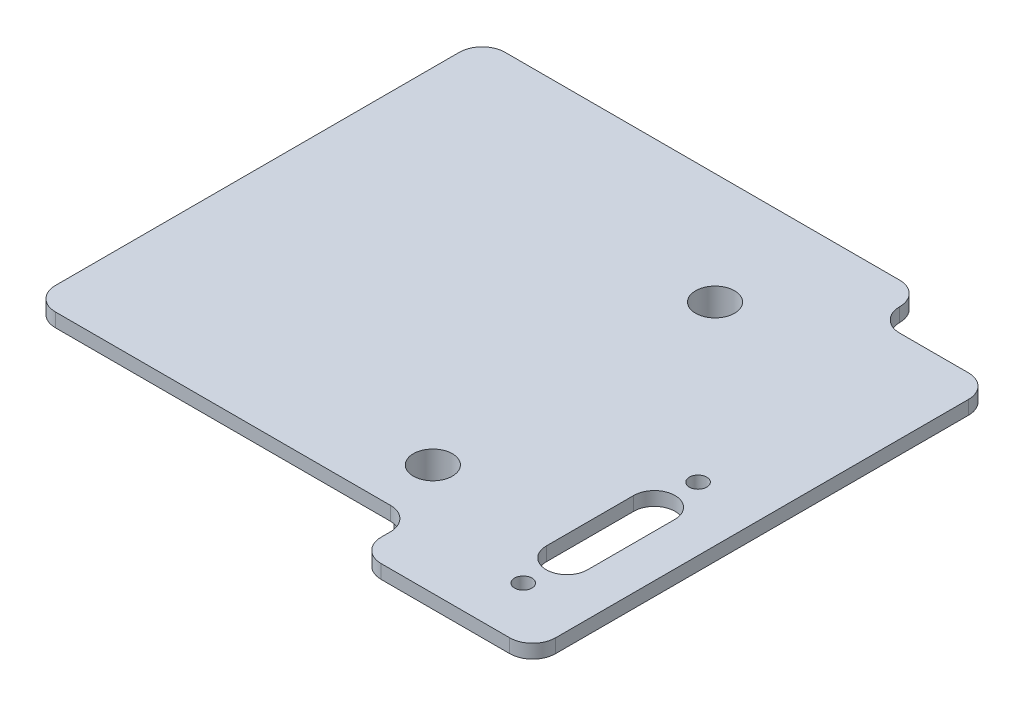
ISO-10303-21;
HEADER;
FILE_DESCRIPTION(('STEP AP214'),'2;1');
FILE_NAME('part.step','',(''),(''),'','','');
FILE_SCHEMA(('AUTOMOTIVE_DESIGN { 1 0 10303 214 1 1 1 1 }'));
ENDSEC;
DATA;
#1=APPLICATION_CONTEXT('core data for automotive mechanical design processes');
#2=APPLICATION_PROTOCOL_DEFINITION('international standard','automotive_design',2000,#1);
#3=PRODUCT_CONTEXT('',#1,'mechanical');
#4=PRODUCT('Part','Part','',(#3));
#5=PRODUCT_RELATED_PRODUCT_CATEGORY('part','',(#4));
#6=PRODUCT_DEFINITION_FORMATION('','',#4);
#7=PRODUCT_DEFINITION_CONTEXT('part definition',#1,'design');
#8=PRODUCT_DEFINITION('design','',#6,#7);
#9=PRODUCT_DEFINITION_SHAPE('','',#8);
#10=(LENGTH_UNIT() NAMED_UNIT(*) SI_UNIT(.MILLI.,.METRE.));
#11=(NAMED_UNIT(*) PLANE_ANGLE_UNIT() SI_UNIT($,.RADIAN.));
#12=(NAMED_UNIT(*) SI_UNIT($,.STERADIAN.) SOLID_ANGLE_UNIT());
#13=UNCERTAINTY_MEASURE_WITH_UNIT(LENGTH_MEASURE(1.E-05),#10,'distance_accuracy_value','');
#14=(GEOMETRIC_REPRESENTATION_CONTEXT(3) GLOBAL_UNCERTAINTY_ASSIGNED_CONTEXT((#13)) GLOBAL_UNIT_ASSIGNED_CONTEXT((#10,
#11,#12)) REPRESENTATION_CONTEXT('',''));
#15=CARTESIAN_POINT('',(0.,0.,0.));
#16=DIRECTION('',(0.,0.,1.));
#17=DIRECTION('',(1.,0.,0.));
#18=AXIS2_PLACEMENT_3D('',#15,#16,#17);
#19=CARTESIAN_POINT('',(0.,3.,-98.));
#20=DIRECTION('',(1.,0.,0.));
#21=DIRECTION('',(0.,0.,-1.));
#22=AXIS2_PLACEMENT_3D('',#19,#20,#21);
#23=PLANE('',#22);
#24=DIRECTION('',(0.,0.,1.));
#25=VECTOR('',#24,1.);
#26=CARTESIAN_POINT('',(0.,3.,-98.));
#27=LINE('',#26,#25);
#28=CARTESIAN_POINT('',(0.,3.,-93.));
#29=VERTEX_POINT('',#28);
#30=CARTESIAN_POINT('',(0.,3.,-5.));
#31=VERTEX_POINT('',#30);
#32=EDGE_CURVE('E224',#29,#31,#27,.T.);
#33=ORIENTED_EDGE('',*,*,#32,.F.);
#34=DIRECTION('',(0.,-1.,0.));
#35=VECTOR('',#34,1.);
#36=CARTESIAN_POINT('',(0.,3.,-93.));
#37=LINE('',#36,#35);
#38=CARTESIAN_POINT('',(0.,0.,-93.));
#39=VERTEX_POINT('',#38);
#40=EDGE_CURVE('E326',#29,#39,#37,.T.);
#41=ORIENTED_EDGE('',*,*,#40,.T.);
#42=DIRECTION('',(0.,0.,1.));
#43=VECTOR('',#42,1.);
#44=CARTESIAN_POINT('',(0.,0.,-98.));
#45=LINE('',#44,#43);
#46=CARTESIAN_POINT('',(0.,0.,-5.));
#47=VERTEX_POINT('',#46);
#48=EDGE_CURVE('E221',#39,#47,#45,.T.);
#49=ORIENTED_EDGE('',*,*,#48,.T.);
#50=DIRECTION('',(0.,-1.,0.));
#51=VECTOR('',#50,1.);
#52=CARTESIAN_POINT('',(0.,3.,-5.));
#53=LINE('',#52,#51);
#54=EDGE_CURVE('E324',#47,#31,#53,.F.);
#55=ORIENTED_EDGE('',*,*,#54,.T.);
#56=EDGE_LOOP('',(#33,#41,#49,#55));
#57=FACE_BOUND('',#56,.T.);
#58=ADVANCED_FACE('F35',(#57),#23,.F.);
#59=CARTESIAN_POINT('',(0.,3.,0.));
#60=DIRECTION('',(0.,0.,-1.));
#61=DIRECTION('',(-1.,0.,0.));
#62=AXIS2_PLACEMENT_3D('',#59,#60,#61);
#63=PLANE('',#62);
#64=DIRECTION('',(1.,0.,0.));
#65=VECTOR('',#64,1.);
#66=CARTESIAN_POINT('',(0.,0.,0.));
#67=LINE('',#66,#65);
#68=CARTESIAN_POINT('',(5.,0.,0.));
#69=VERTEX_POINT('',#68);
#70=CARTESIAN_POINT('',(78.,0.,0.));
#71=VERTEX_POINT('',#70);
#72=EDGE_CURVE('E248',#69,#71,#67,.T.);
#73=ORIENTED_EDGE('',*,*,#72,.T.);
#74=DIRECTION('',(0.,-1.,0.));
#75=VECTOR('',#74,1.);
#76=CARTESIAN_POINT('',(78.,3.,0.));
#77=LINE('',#76,#75);
#78=CARTESIAN_POINT('',(78.,3.,0.));
#79=VERTEX_POINT('',#78);
#80=EDGE_CURVE('E380',#71,#79,#77,.F.);
#81=ORIENTED_EDGE('',*,*,#80,.T.);
#82=DIRECTION('',(1.,0.,0.));
#83=VECTOR('',#82,1.);
#84=CARTESIAN_POINT('',(0.,3.,0.));
#85=LINE('',#84,#83);
#86=CARTESIAN_POINT('',(5.,3.,0.));
#87=VERTEX_POINT('',#86);
#88=EDGE_CURVE('E227',#87,#79,#85,.T.);
#89=ORIENTED_EDGE('',*,*,#88,.F.);
#90=DIRECTION('',(0.,-1.,0.));
#91=VECTOR('',#90,1.);
#92=CARTESIAN_POINT('',(5.,3.,0.));
#93=LINE('',#92,#91);
#94=EDGE_CURVE('E377',#87,#69,#93,.T.);
#95=ORIENTED_EDGE('',*,*,#94,.T.);
#96=EDGE_LOOP('',(#73,#81,#89,#95));
#97=FACE_BOUND('',#96,.T.);
#98=ADVANCED_FACE('F394',(#97),#63,.F.);
#99=CARTESIAN_POINT('',(83.,3.,0.));
#100=DIRECTION('',(1.,0.,0.));
#101=DIRECTION('',(0.,0.,-1.));
#102=AXIS2_PLACEMENT_3D('',#99,#100,#101);
#103=PLANE('',#102);
#104=DIRECTION('',(0.,0.,1.));
#105=VECTOR('',#104,1.);
#106=CARTESIAN_POINT('',(83.,0.,0.));
#107=LINE('',#106,#105);
#108=CARTESIAN_POINT('',(83.,0.,5.));
#109=VERTEX_POINT('',#108);
#110=CARTESIAN_POINT('',(83.,0.,6.99999999999998));
#111=VERTEX_POINT('',#110);
#112=EDGE_CURVE('E251',#109,#111,#107,.T.);
#113=ORIENTED_EDGE('',*,*,#112,.T.);
#114=DIRECTION('',(0.,-1.,0.));
#115=VECTOR('',#114,1.);
#116=CARTESIAN_POINT('',(83.,3.,6.99999999999998));
#117=LINE('',#116,#115);
#118=CARTESIAN_POINT('',(83.,3.,6.99999999999998));
#119=VERTEX_POINT('',#118);
#120=EDGE_CURVE('E375',#111,#119,#117,.F.);
#121=ORIENTED_EDGE('',*,*,#120,.T.);
#122=DIRECTION('',(0.,0.,1.));
#123=VECTOR('',#122,1.);
#124=CARTESIAN_POINT('',(83.,3.,0.));
#125=LINE('',#124,#123);
#126=CARTESIAN_POINT('',(83.,3.,5.));
#127=VERTEX_POINT('',#126);
#128=EDGE_CURVE('E231',#127,#119,#125,.T.);
#129=ORIENTED_EDGE('',*,*,#128,.F.);
#130=DIRECTION('',(0.,-1.,0.));
#131=VECTOR('',#130,1.);
#132=CARTESIAN_POINT('',(83.,0.,5.));
#133=LINE('',#132,#131);
#134=EDGE_CURVE('E372',#127,#109,#133,.T.);
#135=ORIENTED_EDGE('',*,*,#134,.T.);
#136=EDGE_LOOP('',(#113,#121,#129,#135));
#137=FACE_BOUND('',#136,.T.);
#138=ADVANCED_FACE('F402',(#137),#103,.F.);
#139=CARTESIAN_POINT('',(83.,3.,12.));
#140=DIRECTION('',(0.,0.,-1.));
#141=DIRECTION('',(-1.,0.,0.));
#142=AXIS2_PLACEMENT_3D('',#139,#140,#141);
#143=PLANE('',#142);
#144=DIRECTION('',(1.,0.,0.));
#145=VECTOR('',#144,1.);
#146=CARTESIAN_POINT('',(83.,0.,12.));
#147=LINE('',#146,#145);
#148=CARTESIAN_POINT('',(88.,0.,12.));
#149=VERTEX_POINT('',#148);
#150=CARTESIAN_POINT('',(116.,0.,12.));
#151=VERTEX_POINT('',#150);
#152=EDGE_CURVE('E254',#149,#151,#147,.T.);
#153=ORIENTED_EDGE('',*,*,#152,.T.);
#154=DIRECTION('',(0.,-1.,0.));
#155=VECTOR('',#154,1.);
#156=CARTESIAN_POINT('',(116.,3.,12.));
#157=LINE('',#156,#155);
#158=CARTESIAN_POINT('',(116.,3.,12.));
#159=VERTEX_POINT('',#158);
#160=EDGE_CURVE('E370',#151,#159,#157,.F.);
#161=ORIENTED_EDGE('',*,*,#160,.T.);
#162=DIRECTION('',(1.,0.,0.));
#163=VECTOR('',#162,1.);
#164=CARTESIAN_POINT('',(83.,3.,12.));
#165=LINE('',#164,#163);
#166=CARTESIAN_POINT('',(88.,3.,12.));
#167=VERTEX_POINT('',#166);
#168=EDGE_CURVE('E234',#167,#159,#165,.T.);
#169=ORIENTED_EDGE('',*,*,#168,.F.);
#170=DIRECTION('',(0.,-1.,0.));
#171=VECTOR('',#170,1.);
#172=CARTESIAN_POINT('',(88.,3.,12.));
#173=LINE('',#172,#171);
#174=EDGE_CURVE('E367',#167,#149,#173,.T.);
#175=ORIENTED_EDGE('',*,*,#174,.T.);
#176=EDGE_LOOP('',(#153,#161,#169,#175));
#177=FACE_BOUND('',#176,.T.);
#178=ADVANCED_FACE('F410',(#177),#143,.F.);
#179=CARTESIAN_POINT('',(121.,3.,12.));
#180=DIRECTION('',(-1.,0.,0.));
#181=DIRECTION('',(0.,0.,1.));
#182=AXIS2_PLACEMENT_3D('',#179,#180,#181);
#183=PLANE('',#182);
#184=DIRECTION('',(0.,0.,-1.));
#185=VECTOR('',#184,1.);
#186=CARTESIAN_POINT('',(121.,0.,12.));
#187=LINE('',#186,#185);
#188=CARTESIAN_POINT('',(121.,0.,6.99999999999998));
#189=VERTEX_POINT('',#188);
#190=CARTESIAN_POINT('',(121.,0.,-83.));
#191=VERTEX_POINT('',#190);
#192=EDGE_CURVE('E257',#189,#191,#187,.T.);
#193=ORIENTED_EDGE('',*,*,#192,.T.);
#194=DIRECTION('',(0.,-1.,0.));
#195=VECTOR('',#194,1.);
#196=CARTESIAN_POINT('',(121.,3.,-83.));
#197=LINE('',#196,#195);
#198=CARTESIAN_POINT('',(121.,3.,-83.));
#199=VERTEX_POINT('',#198);
#200=EDGE_CURVE('E365',#191,#199,#197,.F.);
#201=ORIENTED_EDGE('',*,*,#200,.T.);
#202=DIRECTION('',(0.,0.,-1.));
#203=VECTOR('',#202,1.);
#204=CARTESIAN_POINT('',(121.,3.,12.));
#205=LINE('',#204,#203);
#206=CARTESIAN_POINT('',(121.,3.,6.99999999999998));
#207=VERTEX_POINT('',#206);
#208=EDGE_CURVE('E237',#207,#199,#205,.T.);
#209=ORIENTED_EDGE('',*,*,#208,.F.);
#210=DIRECTION('',(0.,-1.,0.));
#211=VECTOR('',#210,1.);
#212=CARTESIAN_POINT('',(121.,3.,6.99999999999998));
#213=LINE('',#212,#211);
#214=EDGE_CURVE('E362',#207,#189,#213,.T.);
#215=ORIENTED_EDGE('',*,*,#214,.T.);
#216=EDGE_LOOP('',(#193,#201,#209,#215));
#217=FACE_BOUND('',#216,.T.);
#218=ADVANCED_FACE('F419',(#217),#183,.F.);
#219=CARTESIAN_POINT('',(96.,3.,-88.));
#220=DIRECTION('',(0.,0.,1.));
#221=DIRECTION('',(1.,0.,0.));
#222=AXIS2_PLACEMENT_3D('',#219,#220,#221);
#223=PLANE('',#222);
#224=DIRECTION('',(-1.,0.,0.));
#225=VECTOR('',#224,1.);
#226=CARTESIAN_POINT('',(96.,0.,-88.));
#227=LINE('',#226,#225);
#228=CARTESIAN_POINT('',(116.,0.,-88.));
#229=VERTEX_POINT('',#228);
#230=CARTESIAN_POINT('',(101.,0.,-88.));
#231=VERTEX_POINT('',#230);
#232=EDGE_CURVE('E260',#229,#231,#227,.T.);
#233=ORIENTED_EDGE('',*,*,#232,.T.);
#234=DIRECTION('',(0.,-1.,0.));
#235=VECTOR('',#234,1.);
#236=CARTESIAN_POINT('',(101.,3.,-88.));
#237=LINE('',#236,#235);
#238=CARTESIAN_POINT('',(101.,3.,-88.));
#239=VERTEX_POINT('',#238);
#240=EDGE_CURVE('E59',#231,#239,#237,.F.);
#241=ORIENTED_EDGE('',*,*,#240,.T.);
#242=DIRECTION('',(-1.,0.,0.));
#243=VECTOR('',#242,1.);
#244=CARTESIAN_POINT('',(96.,3.,-88.));
#245=LINE('',#244,#243);
#246=CARTESIAN_POINT('',(116.,3.,-88.));
#247=VERTEX_POINT('',#246);
#248=EDGE_CURVE('E240',#247,#239,#245,.T.);
#249=ORIENTED_EDGE('',*,*,#248,.F.);
#250=DIRECTION('',(0.,-1.,0.));
#251=VECTOR('',#250,1.);
#252=CARTESIAN_POINT('',(116.,3.,-88.));
#253=LINE('',#252,#251);
#254=EDGE_CURVE('E358',#247,#229,#253,.T.);
#255=ORIENTED_EDGE('',*,*,#254,.T.);
#256=EDGE_LOOP('',(#233,#241,#249,#255));
#257=FACE_BOUND('',#256,.T.);
#258=ADVANCED_FACE('F425',(#257),#223,.F.);
#259=CARTESIAN_POINT('',(0.,3.,-98.));
#260=DIRECTION('',(0.,0.,1.));
#261=DIRECTION('',(1.,0.,0.));
#262=AXIS2_PLACEMENT_3D('',#259,#260,#261);
#263=PLANE('',#262);
#264=DIRECTION('',(-1.,0.,0.));
#265=VECTOR('',#264,1.);
#266=CARTESIAN_POINT('',(0.,0.,-98.));
#267=LINE('',#266,#265);
#268=CARTESIAN_POINT('',(91.,0.,-98.));
#269=VERTEX_POINT('',#268);
#270=CARTESIAN_POINT('',(5.,0.,-98.));
#271=VERTEX_POINT('',#270);
#272=EDGE_CURVE('E228',#269,#271,#267,.T.);
#273=ORIENTED_EDGE('',*,*,#272,.T.);
#274=DIRECTION('',(0.,-1.,0.));
#275=VECTOR('',#274,1.);
#276=CARTESIAN_POINT('',(5.,3.,-98.));
#277=LINE('',#276,#275);
#278=CARTESIAN_POINT('',(5.,3.,-98.));
#279=VERTEX_POINT('',#278);
#280=EDGE_CURVE('E344',#271,#279,#277,.F.);
#281=ORIENTED_EDGE('',*,*,#280,.T.);
#282=DIRECTION('',(-1.,0.,0.));
#283=VECTOR('',#282,1.);
#284=CARTESIAN_POINT('',(0.,3.,-98.));
#285=LINE('',#284,#283);
#286=CARTESIAN_POINT('',(91.,3.,-98.));
#287=VERTEX_POINT('',#286);
#288=EDGE_CURVE('E242',#287,#279,#285,.T.);
#289=ORIENTED_EDGE('',*,*,#288,.F.);
#290=DIRECTION('',(0.,-1.,0.));
#291=VECTOR('',#290,1.);
#292=CARTESIAN_POINT('',(91.,3.,-98.));
#293=LINE('',#292,#291);
#294=EDGE_CURVE('E341',#287,#269,#293,.T.);
#295=ORIENTED_EDGE('',*,*,#294,.T.);
#296=EDGE_LOOP('',(#273,#281,#289,#295));
#297=FACE_BOUND('',#296,.T.);
#298=ADVANCED_FACE('F489',(#297),#263,.F.);
#299=CARTESIAN_POINT('',(0.,3.,0.));
#300=DIRECTION('',(0.,1.,0.));
#301=DIRECTION('',(0.,0.,1.));
#302=AXIS2_PLACEMENT_3D('',#299,#300,#301);
#303=PLANE('',#302);
#304=CARTESIAN_POINT('',(107.15,3.,0.199999999999985));
#305=DIRECTION('',(0.,1.,0.));
#306=DIRECTION('',(0.,0.,1.));
#307=AXIS2_PLACEMENT_3D('',#304,#305,#306);
#308=CIRCLE('',#307,1.89999999999999);
#309=CARTESIAN_POINT('',(107.15,3.,2.09999999999997));
#310=VERTEX_POINT('',#309);
#311=EDGE_CURVE('E436',#310,#310,#308,.T.);
#312=ORIENTED_EDGE('',*,*,#311,.F.);
#313=EDGE_LOOP('',(#312));
#314=FACE_BOUND('',#313,.T.);
#315=CARTESIAN_POINT('',(107.15,3.,-37.9));
#316=DIRECTION('',(0.,1.,0.));
#317=DIRECTION('',(0.,0.,1.));
#318=AXIS2_PLACEMENT_3D('',#315,#316,#317);
#319=CIRCLE('',#318,1.89999999999999);
#320=CARTESIAN_POINT('',(107.15,3.,-36.));
#321=VERTEX_POINT('',#320);
#322=EDGE_CURVE('E438',#321,#321,#319,.T.);
#323=ORIENTED_EDGE('',*,*,#322,.F.);
#324=EDGE_LOOP('',(#323));
#325=FACE_BOUND('',#324,.T.);
#326=CARTESIAN_POINT('',(107.15,3.,-9.32500000000001));
#327=DIRECTION('',(0.,1.,0.));
#328=DIRECTION('',(0.,0.,1.));
#329=AXIS2_PLACEMENT_3D('',#326,#327,#328);
#330=CIRCLE('',#329,4.5);
#331=CARTESIAN_POINT('',(102.65,3.,-9.32500000000001));
#332=VERTEX_POINT('',#331);
#333=CARTESIAN_POINT('',(111.65,3.,-9.32500000000001));
#334=VERTEX_POINT('',#333);
#335=EDGE_CURVE('E189',#332,#334,#330,.T.);
#336=ORIENTED_EDGE('',*,*,#335,.F.);
#337=DIRECTION('',(0.,0.,1.));
#338=VECTOR('',#337,1.);
#339=CARTESIAN_POINT('',(102.65,3.,-9.32500000000001));
#340=LINE('',#339,#338);
#341=CARTESIAN_POINT('',(102.65,3.,-28.375));
#342=VERTEX_POINT('',#341);
#343=EDGE_CURVE('E194',#342,#332,#340,.T.);
#344=ORIENTED_EDGE('',*,*,#343,.F.);
#345=CARTESIAN_POINT('',(107.15,3.,-28.375));
#346=DIRECTION('',(0.,1.,0.));
#347=DIRECTION('',(0.,0.,-1.));
#348=AXIS2_PLACEMENT_3D('',#345,#346,#347);
#349=CIRCLE('',#348,4.5);
#350=CARTESIAN_POINT('',(111.65,3.,-28.375));
#351=VERTEX_POINT('',#350);
#352=EDGE_CURVE('E173',#351,#342,#349,.T.);
#353=ORIENTED_EDGE('',*,*,#352,.F.);
#354=DIRECTION('',(0.,0.,-1.));
#355=VECTOR('',#354,1.);
#356=CARTESIAN_POINT('',(111.65,3.,-9.32500000000001));
#357=LINE('',#356,#355);
#358=EDGE_CURVE('E184',#334,#351,#357,.T.);
#359=ORIENTED_EDGE('',*,*,#358,.F.);
#360=EDGE_LOOP('',(#336,#344,#353,#359));
#361=FACE_BOUND('',#360,.T.);
#362=CARTESIAN_POINT('',(75.,3.,-73.75));
#363=DIRECTION('',(0.,1.,0.));
#364=DIRECTION('',(0.,0.,1.));
#365=AXIS2_PLACEMENT_3D('',#362,#363,#364);
#366=CIRCLE('',#365,4.25000000000001);
#367=CARTESIAN_POINT('',(75.,3.,-69.5));
#368=VERTEX_POINT('',#367);
#369=EDGE_CURVE('E218',#368,#368,#366,.T.);
#370=ORIENTED_EDGE('',*,*,#369,.F.);
#371=EDGE_LOOP('',(#370));
#372=FACE_BOUND('',#371,.T.);
#373=CARTESIAN_POINT('',(75.,3.,-12.25));
#374=DIRECTION('',(0.,1.,0.));
#375=DIRECTION('',(0.,0.,1.));
#376=AXIS2_PLACEMENT_3D('',#373,#374,#375);
#377=CIRCLE('',#376,4.25000000000001);
#378=CARTESIAN_POINT('',(75.,3.,-8.00000000000001));
#379=VERTEX_POINT('',#378);
#380=EDGE_CURVE('E217',#379,#379,#377,.T.);
#381=ORIENTED_EDGE('',*,*,#380,.F.);
#382=EDGE_LOOP('',(#381));
#383=FACE_BOUND('',#382,.T.);
#384=ORIENTED_EDGE('',*,*,#288,.T.);
#385=CARTESIAN_POINT('',(5.,3.,-93.));
#386=DIRECTION('',(0.,1.,0.));
#387=DIRECTION('',(0.,0.,1.));
#388=AXIS2_PLACEMENT_3D('',#385,#386,#387);
#389=CIRCLE('',#388,5.);
#390=EDGE_CURVE('E356',#279,#29,#389,.T.);
#391=ORIENTED_EDGE('',*,*,#390,.T.);
#392=ORIENTED_EDGE('',*,*,#32,.T.);
#393=CARTESIAN_POINT('',(5.,3.,-5.));
#394=DIRECTION('',(0.,1.,0.));
#395=DIRECTION('',(0.,0.,1.));
#396=AXIS2_PLACEMENT_3D('',#393,#394,#395);
#397=CIRCLE('',#396,5.);
#398=EDGE_CURVE('E346',#31,#87,#397,.T.);
#399=ORIENTED_EDGE('',*,*,#398,.T.);
#400=ORIENTED_EDGE('',*,*,#88,.T.);
#401=CARTESIAN_POINT('',(78.,3.,5.));
#402=DIRECTION('',(0.,1.,0.));
#403=DIRECTION('',(0.,0.,1.));
#404=AXIS2_PLACEMENT_3D('',#401,#402,#403);
#405=CIRCLE('',#404,5.);
#406=EDGE_CURVE('E11',#79,#127,#405,.F.);
#407=ORIENTED_EDGE('',*,*,#406,.T.);
#408=ORIENTED_EDGE('',*,*,#128,.T.);
#409=CARTESIAN_POINT('',(88.,3.,6.99999999999998));
#410=DIRECTION('',(0.,1.,0.));
#411=DIRECTION('',(0.,0.,1.));
#412=AXIS2_PLACEMENT_3D('',#409,#410,#411);
#413=CIRCLE('',#412,5.);
#414=EDGE_CURVE('E348',#119,#167,#413,.T.);
#415=ORIENTED_EDGE('',*,*,#414,.T.);
#416=ORIENTED_EDGE('',*,*,#168,.T.);
#417=CARTESIAN_POINT('',(116.,3.,6.99999999999998));
#418=DIRECTION('',(0.,1.,0.));
#419=DIRECTION('',(0.,0.,1.));
#420=AXIS2_PLACEMENT_3D('',#417,#418,#419);
#421=CIRCLE('',#420,5.);
#422=EDGE_CURVE('E350',#159,#207,#421,.T.);
#423=ORIENTED_EDGE('',*,*,#422,.T.);
#424=ORIENTED_EDGE('',*,*,#208,.T.);
#425=CARTESIAN_POINT('',(116.,3.,-83.));
#426=DIRECTION('',(0.,1.,0.));
#427=DIRECTION('',(0.,0.,1.));
#428=AXIS2_PLACEMENT_3D('',#425,#426,#427);
#429=CIRCLE('',#428,5.);
#430=EDGE_CURVE('E352',#199,#247,#429,.T.);
#431=ORIENTED_EDGE('',*,*,#430,.T.);
#432=ORIENTED_EDGE('',*,*,#248,.T.);
#433=CARTESIAN_POINT('',(101.,3.,-93.));
#434=DIRECTION('',(0.,1.,0.));
#435=DIRECTION('',(0.,0.,1.));
#436=AXIS2_PLACEMENT_3D('',#433,#434,#435);
#437=CIRCLE('',#436,5.);
#438=CARTESIAN_POINT('',(96.,3.,-93.));
#439=VERTEX_POINT('',#438);
#440=EDGE_CURVE('E51',#239,#439,#437,.F.);
#441=ORIENTED_EDGE('',*,*,#440,.T.);
#442=CARTESIAN_POINT('',(91.,3.,-93.));
#443=DIRECTION('',(0.,1.,0.));
#444=DIRECTION('',(0.,0.,1.));
#445=AXIS2_PLACEMENT_3D('',#442,#443,#444);
#446=CIRCLE('',#445,5.);
#447=EDGE_CURVE('E354',#439,#287,#446,.T.);
#448=ORIENTED_EDGE('',*,*,#447,.T.);
#449=EDGE_LOOP('',(#384,#391,#392,#399,#400,#407,#408,#415,#416,#423,#424,#431,#432,#441,#448));
#450=FACE_BOUND('',#449,.T.);
#451=ADVANCED_FACE('F191',(#314,#325,#361,#372,#383,#450),#303,.T.);
#452=CARTESIAN_POINT('',(0.,0.,0.));
#453=DIRECTION('',(0.,1.,0.));
#454=DIRECTION('',(0.,0.,1.));
#455=AXIS2_PLACEMENT_3D('',#452,#453,#454);
#456=PLANE('',#455);
#457=CARTESIAN_POINT('',(75.,0.,-73.75));
#458=DIRECTION('',(0.,1.,0.));
#459=DIRECTION('',(0.,0.,1.));
#460=AXIS2_PLACEMENT_3D('',#457,#458,#459);
#461=CIRCLE('',#460,7.5);
#462=CARTESIAN_POINT('',(75.,0.,-66.25));
#463=VERTEX_POINT('',#462);
#464=EDGE_CURVE('E315',#463,#463,#461,.T.);
#465=ORIENTED_EDGE('',*,*,#464,.T.);
#466=EDGE_LOOP('',(#465));
#467=FACE_BOUND('',#466,.T.);
#468=CARTESIAN_POINT('',(75.,0.,-12.25));
#469=DIRECTION('',(0.,1.,0.));
#470=DIRECTION('',(0.,0.,1.));
#471=AXIS2_PLACEMENT_3D('',#468,#469,#470);
#472=CIRCLE('',#471,7.5);
#473=CARTESIAN_POINT('',(75.,0.,-4.75000000000001));
#474=VERTEX_POINT('',#473);
#475=EDGE_CURVE('E312',#474,#474,#472,.T.);
#476=ORIENTED_EDGE('',*,*,#475,.T.);
#477=EDGE_LOOP('',(#476));
#478=FACE_BOUND('',#477,.T.);
#479=CARTESIAN_POINT('',(107.15,0.,0.199999999999985));
#480=DIRECTION('',(0.,1.,0.));
#481=DIRECTION('',(0.,0.,1.));
#482=AXIS2_PLACEMENT_3D('',#479,#480,#481);
#483=CIRCLE('',#482,1.89999999999999);
#484=CARTESIAN_POINT('',(107.15,0.,2.09999999999997));
#485=VERTEX_POINT('',#484);
#486=EDGE_CURVE('E208',#485,#485,#483,.T.);
#487=ORIENTED_EDGE('',*,*,#486,.T.);
#488=EDGE_LOOP('',(#487));
#489=FACE_BOUND('',#488,.T.);
#490=CARTESIAN_POINT('',(107.15,0.,-37.9));
#491=DIRECTION('',(0.,1.,0.));
#492=DIRECTION('',(0.,0.,1.));
#493=AXIS2_PLACEMENT_3D('',#490,#491,#492);
#494=CIRCLE('',#493,1.89999999999999);
#495=CARTESIAN_POINT('',(107.15,0.,-36.));
#496=VERTEX_POINT('',#495);
#497=EDGE_CURVE('E201',#496,#496,#494,.T.);
#498=ORIENTED_EDGE('',*,*,#497,.T.);
#499=EDGE_LOOP('',(#498));
#500=FACE_BOUND('',#499,.T.);
#501=DIRECTION('',(0.,0.,1.));
#502=VECTOR('',#501,1.);
#503=CARTESIAN_POINT('',(102.65,0.,0.));
#504=LINE('',#503,#502);
#505=CARTESIAN_POINT('',(102.65,0.,-28.375));
#506=VERTEX_POINT('',#505);
#507=CARTESIAN_POINT('',(102.65,0.,-9.32500000000001));
#508=VERTEX_POINT('',#507);
#509=EDGE_CURVE('E278',#506,#508,#504,.T.);
#510=ORIENTED_EDGE('',*,*,#509,.T.);
#511=CARTESIAN_POINT('',(107.15,0.,-9.32500000000001));
#512=DIRECTION('',(0.,1.,0.));
#513=DIRECTION('',(0.,0.,1.));
#514=AXIS2_PLACEMENT_3D('',#511,#512,#513);
#515=CIRCLE('',#514,4.5);
#516=CARTESIAN_POINT('',(111.65,0.,-9.32500000000001));
#517=VERTEX_POINT('',#516);
#518=EDGE_CURVE('E281',#508,#517,#515,.T.);
#519=ORIENTED_EDGE('',*,*,#518,.T.);
#520=DIRECTION('',(0.,0.,-1.));
#521=VECTOR('',#520,1.);
#522=CARTESIAN_POINT('',(111.65,0.,0.));
#523=LINE('',#522,#521);
#524=CARTESIAN_POINT('',(111.65,0.,-28.375));
#525=VERTEX_POINT('',#524);
#526=EDGE_CURVE('E275',#517,#525,#523,.T.);
#527=ORIENTED_EDGE('',*,*,#526,.T.);
#528=CARTESIAN_POINT('',(107.15,0.,-28.375));
#529=DIRECTION('',(0.,1.,0.));
#530=DIRECTION('',(0.,0.,1.));
#531=AXIS2_PLACEMENT_3D('',#528,#529,#530);
#532=CIRCLE('',#531,4.5);
#533=EDGE_CURVE('E176',#525,#506,#532,.T.);
#534=ORIENTED_EDGE('',*,*,#533,.T.);
#535=EDGE_LOOP('',(#510,#519,#527,#534));
#536=FACE_BOUND('',#535,.T.);
#537=CARTESIAN_POINT('',(40.,0.,-43.));
#538=DIRECTION('',(0.,1.,0.));
#539=DIRECTION('',(0.,0.,1.));
#540=AXIS2_PLACEMENT_3D('',#537,#538,#539);
#541=CIRCLE('',#540,8.26221140045425);
#542=CARTESIAN_POINT('',(40.,0.,-34.7377885995458));
#543=VERTEX_POINT('',#542);
#544=EDGE_CURVE('E269',#543,#543,#541,.T.);
#545=ORIENTED_EDGE('',*,*,#544,.T.);
#546=EDGE_LOOP('',(#545));
#547=FACE_BOUND('',#546,.T.);
#548=ORIENTED_EDGE('',*,*,#48,.F.);
#549=CARTESIAN_POINT('',(5.,0.,-93.));
#550=DIRECTION('',(0.,1.,0.));
#551=DIRECTION('',(0.,0.,1.));
#552=AXIS2_PLACEMENT_3D('',#549,#550,#551);
#553=CIRCLE('',#552,5.);
#554=EDGE_CURVE('E339',#39,#271,#553,.F.);
#555=ORIENTED_EDGE('',*,*,#554,.T.);
#556=ORIENTED_EDGE('',*,*,#272,.F.);
#557=CARTESIAN_POINT('',(91.,0.,-93.));
#558=DIRECTION('',(0.,1.,0.));
#559=DIRECTION('',(0.,0.,1.));
#560=AXIS2_PLACEMENT_3D('',#557,#558,#559);
#561=CIRCLE('',#560,5.);
#562=CARTESIAN_POINT('',(96.,0.,-93.));
#563=VERTEX_POINT('',#562);
#564=EDGE_CURVE('E337',#269,#563,#561,.F.);
#565=ORIENTED_EDGE('',*,*,#564,.T.);
#566=CARTESIAN_POINT('',(101.,0.,-93.));
#567=DIRECTION('',(0.,1.,0.));
#568=DIRECTION('',(0.,0.,1.));
#569=AXIS2_PLACEMENT_3D('',#566,#567,#568);
#570=CIRCLE('',#569,5.);
#571=EDGE_CURVE('E382',#563,#231,#570,.T.);
#572=ORIENTED_EDGE('',*,*,#571,.T.);
#573=ORIENTED_EDGE('',*,*,#232,.F.);
#574=CARTESIAN_POINT('',(116.,0.,-83.));
#575=DIRECTION('',(0.,1.,0.));
#576=DIRECTION('',(0.,0.,1.));
#577=AXIS2_PLACEMENT_3D('',#574,#575,#576);
#578=CIRCLE('',#577,5.);
#579=EDGE_CURVE('E335',#229,#191,#578,.F.);
#580=ORIENTED_EDGE('',*,*,#579,.T.);
#581=ORIENTED_EDGE('',*,*,#192,.F.);
#582=CARTESIAN_POINT('',(116.,0.,6.99999999999998));
#583=DIRECTION('',(0.,1.,0.));
#584=DIRECTION('',(0.,0.,1.));
#585=AXIS2_PLACEMENT_3D('',#582,#583,#584);
#586=CIRCLE('',#585,5.);
#587=EDGE_CURVE('E333',#189,#151,#586,.F.);
#588=ORIENTED_EDGE('',*,*,#587,.T.);
#589=ORIENTED_EDGE('',*,*,#152,.F.);
#590=CARTESIAN_POINT('',(88.,0.,6.99999999999998));
#591=DIRECTION('',(0.,1.,0.));
#592=DIRECTION('',(0.,0.,1.));
#593=AXIS2_PLACEMENT_3D('',#590,#591,#592);
#594=CIRCLE('',#593,5.);
#595=EDGE_CURVE('E331',#149,#111,#594,.F.);
#596=ORIENTED_EDGE('',*,*,#595,.T.);
#597=ORIENTED_EDGE('',*,*,#112,.F.);
#598=CARTESIAN_POINT('',(78.,0.,5.));
#599=DIRECTION('',(0.,1.,0.));
#600=DIRECTION('',(0.,0.,1.));
#601=AXIS2_PLACEMENT_3D('',#598,#599,#600);
#602=CIRCLE('',#601,5.);
#603=EDGE_CURVE('E44',#109,#71,#602,.T.);
#604=ORIENTED_EDGE('',*,*,#603,.T.);
#605=ORIENTED_EDGE('',*,*,#72,.F.);
#606=CARTESIAN_POINT('',(5.,0.,-5.));
#607=DIRECTION('',(0.,1.,0.));
#608=DIRECTION('',(0.,0.,1.));
#609=AXIS2_PLACEMENT_3D('',#606,#607,#608);
#610=CIRCLE('',#609,5.);
#611=EDGE_CURVE('E329',#69,#47,#610,.F.);
#612=ORIENTED_EDGE('',*,*,#611,.T.);
#613=EDGE_LOOP('',(#548,#555,#556,#565,#572,#573,#580,#581,#588,#589,#596,#597,#604,#605,#612));
#614=FACE_BOUND('',#613,.T.);
#615=ADVANCED_FACE('F389',(#467,#478,#489,#500,#536,#547,#614),#456,.F.);
#616=CARTESIAN_POINT('',(75.,-19.,-73.75));
#617=DIRECTION('',(0.,1.,0.));
#618=DIRECTION('',(0.,0.,1.));
#619=AXIS2_PLACEMENT_3D('',#616,#617,#618);
#620=CYLINDRICAL_SURFACE('',#619,6.);
#621=CARTESIAN_POINT('',(75.,-1.5,-73.75));
#622=DIRECTION('',(0.,1.,0.));
#623=DIRECTION('',(0.,0.,1.));
#624=AXIS2_PLACEMENT_3D('',#621,#622,#623);
#625=CIRCLE('',#624,6.);
#626=CARTESIAN_POINT('',(75.,-1.5,-67.75));
#627=VERTEX_POINT('',#626);
#628=EDGE_CURVE('E318',#627,#627,#625,.F.);
#629=ORIENTED_EDGE('',*,*,#628,.T.);
#630=EDGE_LOOP('',(#629));
#631=FACE_BOUND('',#630,.T.);
#632=CARTESIAN_POINT('',(75.,-18.,-73.75));
#633=DIRECTION('',(0.,1.,0.));
#634=DIRECTION('',(0.,0.,1.));
#635=AXIS2_PLACEMENT_3D('',#632,#633,#634);
#636=CIRCLE('',#635,6.);
#637=CARTESIAN_POINT('',(75.,-18.,-67.75));
#638=VERTEX_POINT('',#637);
#639=EDGE_CURVE('E306',#638,#638,#636,.T.);
#640=ORIENTED_EDGE('',*,*,#639,.T.);
#641=EDGE_LOOP('',(#640));
#642=FACE_BOUND('',#641,.T.);
#643=ADVANCED_FACE('F452',(#631,#642),#620,.T.);
#644=CARTESIAN_POINT('',(75.,-19.,-73.75));
#645=DIRECTION('',(0.,1.,0.));
#646=DIRECTION('',(0.,0.,1.));
#647=AXIS2_PLACEMENT_3D('',#644,#645,#646);
#648=PLANE('',#647);
#649=CARTESIAN_POINT('',(75.,-19.,-73.75));
#650=DIRECTION('',(0.,1.,0.));
#651=DIRECTION('',(0.,0.,1.));
#652=AXIS2_PLACEMENT_3D('',#649,#650,#651);
#653=CIRCLE('',#652,4.99999999999995);
#654=CARTESIAN_POINT('',(75.,-19.,-68.7500000000001));
#655=VERTEX_POINT('',#654);
#656=EDGE_CURVE('E309',#655,#655,#653,.F.);
#657=ORIENTED_EDGE('',*,*,#656,.T.);
#658=EDGE_LOOP('',(#657));
#659=FACE_BOUND('',#658,.T.);
#660=CARTESIAN_POINT('',(75.,-19.,-73.75));
#661=DIRECTION('',(0.,1.,0.));
#662=DIRECTION('',(0.,0.,1.));
#663=AXIS2_PLACEMENT_3D('',#660,#661,#662);
#664=CIRCLE('',#663,2.2479);
#665=CARTESIAN_POINT('',(75.,-19.,-71.5021));
#666=VERTEX_POINT('',#665);
#667=EDGE_CURVE('E211',#666,#666,#664,.T.);
#668=ORIENTED_EDGE('',*,*,#667,.T.);
#669=EDGE_LOOP('',(#668));
#670=FACE_BOUND('',#669,.T.);
#671=ADVANCED_FACE('F498',(#659,#670),#648,.F.);
#672=CARTESIAN_POINT('',(75.,-19.,-12.25));
#673=DIRECTION('',(0.,1.,0.));
#674=DIRECTION('',(0.,0.,1.));
#675=AXIS2_PLACEMENT_3D('',#672,#673,#674);
#676=CYLINDRICAL_SURFACE('',#675,6.);
#677=CARTESIAN_POINT('',(75.,-1.5,-12.25));
#678=DIRECTION('',(0.,1.,0.));
#679=DIRECTION('',(0.,0.,1.));
#680=AXIS2_PLACEMENT_3D('',#677,#678,#679);
#681=CIRCLE('',#680,6.);
#682=CARTESIAN_POINT('',(75.,-1.5,-6.25000000000001));
#683=VERTEX_POINT('',#682);
#684=EDGE_CURVE('E321',#683,#683,#681,.F.);
#685=ORIENTED_EDGE('',*,*,#684,.T.);
#686=EDGE_LOOP('',(#685));
#687=FACE_BOUND('',#686,.T.);
#688=CARTESIAN_POINT('',(75.,-18.,-12.25));
#689=DIRECTION('',(0.,1.,0.));
#690=DIRECTION('',(0.,0.,1.));
#691=AXIS2_PLACEMENT_3D('',#688,#689,#690);
#692=CIRCLE('',#691,6.);
#693=CARTESIAN_POINT('',(75.,-18.,-6.25000000000001));
#694=VERTEX_POINT('',#693);
#695=EDGE_CURVE('E300',#694,#694,#692,.T.);
#696=ORIENTED_EDGE('',*,*,#695,.T.);
#697=EDGE_LOOP('',(#696));
#698=FACE_BOUND('',#697,.T.);
#699=ADVANCED_FACE('F502',(#687,#698),#676,.T.);
#700=CARTESIAN_POINT('',(75.,-19.,-12.25));
#701=DIRECTION('',(0.,1.,0.));
#702=DIRECTION('',(0.,0.,1.));
#703=AXIS2_PLACEMENT_3D('',#700,#701,#702);
#704=PLANE('',#703);
#705=CARTESIAN_POINT('',(75.,-19.,-12.25));
#706=DIRECTION('',(0.,1.,0.));
#707=DIRECTION('',(0.,0.,1.));
#708=AXIS2_PLACEMENT_3D('',#705,#706,#707);
#709=CIRCLE('',#708,4.99999999999995);
#710=CARTESIAN_POINT('',(75.,-19.,-7.25000000000006));
#711=VERTEX_POINT('',#710);
#712=EDGE_CURVE('E303',#711,#711,#709,.F.);
#713=ORIENTED_EDGE('',*,*,#712,.T.);
#714=EDGE_LOOP('',(#713));
#715=FACE_BOUND('',#714,.T.);
#716=CARTESIAN_POINT('',(75.,-19.,-12.25));
#717=DIRECTION('',(0.,1.,0.));
#718=DIRECTION('',(0.,0.,1.));
#719=AXIS2_PLACEMENT_3D('',#716,#717,#718);
#720=CIRCLE('',#719,2.2479);
#721=CARTESIAN_POINT('',(75.,-19.,-10.0021));
#722=VERTEX_POINT('',#721);
#723=EDGE_CURVE('E214',#722,#722,#720,.T.);
#724=ORIENTED_EDGE('',*,*,#723,.T.);
#725=EDGE_LOOP('',(#724));
#726=FACE_BOUND('',#725,.T.);
#727=ADVANCED_FACE('F506',(#715,#726),#704,.F.);
#728=CARTESIAN_POINT('',(75.,-16.5,-12.25));
#729=DIRECTION('',(0.,1.,0.));
#730=DIRECTION('',(0.,0.,1.));
#731=AXIS2_PLACEMENT_3D('',#728,#729,#730);
#732=CYLINDRICAL_SURFACE('',#731,4.25000000000001);
#733=CARTESIAN_POINT('',(75.,-13.5,-12.25));
#734=DIRECTION('',(0.,1.,0.));
#735=DIRECTION('',(0.,0.,1.));
#736=AXIS2_PLACEMENT_3D('',#733,#734,#735);
#737=CIRCLE('',#736,4.25000000000001);
#738=CARTESIAN_POINT('',(75.,-13.5,-8.00000000000001));
#739=VERTEX_POINT('',#738);
#740=EDGE_CURVE('E291',#739,#739,#737,.F.);
#741=ORIENTED_EDGE('',*,*,#740,.T.);
#742=EDGE_LOOP('',(#741));
#743=FACE_BOUND('',#742,.T.);
#744=ORIENTED_EDGE('',*,*,#380,.T.);
#745=EDGE_LOOP('',(#744));
#746=FACE_BOUND('',#745,.T.);
#747=ADVANCED_FACE('F510',(#743,#746),#732,.F.);
#748=CARTESIAN_POINT('',(75.,-16.5,-73.75));
#749=DIRECTION('',(0.,1.,0.));
#750=DIRECTION('',(0.,0.,1.));
#751=AXIS2_PLACEMENT_3D('',#748,#749,#750);
#752=CYLINDRICAL_SURFACE('',#751,4.25000000000001);
#753=CARTESIAN_POINT('',(75.,-13.5,-73.75));
#754=DIRECTION('',(0.,1.,0.));
#755=DIRECTION('',(0.,0.,1.));
#756=AXIS2_PLACEMENT_3D('',#753,#754,#755);
#757=CIRCLE('',#756,4.25000000000001);
#758=CARTESIAN_POINT('',(75.,-13.5,-69.5));
#759=VERTEX_POINT('',#758);
#760=EDGE_CURVE('E284',#759,#759,#757,.F.);
#761=ORIENTED_EDGE('',*,*,#760,.T.);
#762=EDGE_LOOP('',(#761));
#763=FACE_BOUND('',#762,.T.);
#764=ORIENTED_EDGE('',*,*,#369,.T.);
#765=EDGE_LOOP('',(#764));
#766=FACE_BOUND('',#765,.T.);
#767=ADVANCED_FACE('F514',(#763,#766),#752,.F.);
#768=CARTESIAN_POINT('',(75.,-16.5,-12.25));
#769=DIRECTION('',(0.,1.,0.));
#770=DIRECTION('',(0.,0.,1.));
#771=AXIS2_PLACEMENT_3D('',#768,#769,#770);
#772=CYLINDRICAL_SURFACE('',#771,2.2479);
#773=CARTESIAN_POINT('',(75.,-15.5021,-12.25));
#774=DIRECTION('',(0.,1.,0.));
#775=DIRECTION('',(0.,0.,1.));
#776=AXIS2_PLACEMENT_3D('',#773,#774,#775);
#777=CIRCLE('',#776,2.2479);
#778=CARTESIAN_POINT('',(75.,-15.5021,-10.0021));
#779=VERTEX_POINT('',#778);
#780=EDGE_CURVE('E297',#779,#779,#777,.T.);
#781=ORIENTED_EDGE('',*,*,#780,.T.);
#782=EDGE_LOOP('',(#781));
#783=FACE_BOUND('',#782,.T.);
#784=ORIENTED_EDGE('',*,*,#723,.F.);
#785=EDGE_LOOP('',(#784));
#786=FACE_BOUND('',#785,.T.);
#787=ADVANCED_FACE('F518',(#783,#786),#772,.F.);
#788=CARTESIAN_POINT('',(75.,-16.5,-73.75));
#789=DIRECTION('',(0.,1.,0.));
#790=DIRECTION('',(0.,0.,1.));
#791=AXIS2_PLACEMENT_3D('',#788,#789,#790);
#792=CYLINDRICAL_SURFACE('',#791,2.2479);
#793=CARTESIAN_POINT('',(75.,-15.5021,-73.75));
#794=DIRECTION('',(0.,1.,0.));
#795=DIRECTION('',(0.,0.,1.));
#796=AXIS2_PLACEMENT_3D('',#793,#794,#795);
#797=CIRCLE('',#796,2.2479);
#798=CARTESIAN_POINT('',(75.,-15.5021,-71.5021));
#799=VERTEX_POINT('',#798);
#800=EDGE_CURVE('E294',#799,#799,#797,.T.);
#801=ORIENTED_EDGE('',*,*,#800,.T.);
#802=EDGE_LOOP('',(#801));
#803=FACE_BOUND('',#802,.T.);
#804=ORIENTED_EDGE('',*,*,#667,.F.);
#805=EDGE_LOOP('',(#804));
#806=FACE_BOUND('',#805,.T.);
#807=ADVANCED_FACE('F522',(#803,#806),#792,.F.);
#808=CARTESIAN_POINT('',(40.,-29.,-43.));
#809=DIRECTION('',(0.,1.,0.));
#810=DIRECTION('',(0.,0.,1.));
#811=AXIS2_PLACEMENT_3D('',#808,#809,#810);
#812=CONICAL_SURFACE('',#811,3.5,0.0602717386843928);
#813=CARTESIAN_POINT('',(40.,-1.59035288094547,-43.));
#814=DIRECTION('',(0.,-1.,0.));
#815=DIRECTION('',(0.,0.,-1.));
#816=AXIS2_PLACEMENT_3D('',#813,#814,#815);
#817=CIRCLE('',#816,5.15403042959811);
#818=CARTESIAN_POINT('',(40.,-1.59035288094547,-48.1540304295981));
#819=VERTEX_POINT('',#818);
#820=EDGE_CURVE('E245',#819,#819,#817,.F.);
#821=ORIENTED_EDGE('',*,*,#820,.T.);
#822=EDGE_LOOP('',(#821));
#823=FACE_BOUND('',#822,.T.);
#824=CARTESIAN_POINT('',(40.,-29.,-43.));
#825=DIRECTION('',(0.,1.,0.));
#826=DIRECTION('',(0.,0.,1.));
#827=AXIS2_PLACEMENT_3D('',#824,#825,#826);
#828=CIRCLE('',#827,3.5);
#829=CARTESIAN_POINT('',(40.,-29.,-39.5));
#830=VERTEX_POINT('',#829);
#831=EDGE_CURVE('E207',#830,#830,#828,.T.);
#832=ORIENTED_EDGE('',*,*,#831,.F.);
#833=EDGE_LOOP('',(#832));
#834=FACE_BOUND('',#833,.T.);
#835=ADVANCED_FACE('F526',(#823,#834),#812,.F.);
#836=CARTESIAN_POINT('',(43.5,-29.,-43.));
#837=DIRECTION('',(0.,-1.,0.));
#838=DIRECTION('',(0.,0.,-1.));
#839=AXIS2_PLACEMENT_3D('',#836,#837,#838);
#840=PLANE('',#839);
#841=ORIENTED_EDGE('',*,*,#831,.T.);
#842=EDGE_LOOP('',(#841));
#843=FACE_BOUND('',#842,.T.);
#844=CARTESIAN_POINT('',(40.,-29.,-43.));
#845=DIRECTION('',(0.,1.,0.));
#846=DIRECTION('',(0.,0.,1.));
#847=AXIS2_PLACEMENT_3D('',#844,#845,#846);
#848=CIRCLE('',#847,5.1);
#849=CARTESIAN_POINT('',(40.,-29.,-37.9));
#850=VERTEX_POINT('',#849);
#851=EDGE_CURVE('E204',#850,#850,#848,.T.);
#852=ORIENTED_EDGE('',*,*,#851,.F.);
#853=EDGE_LOOP('',(#852));
#854=FACE_BOUND('',#853,.T.);
#855=ADVANCED_FACE('F530',(#843,#854),#840,.T.);
#856=CARTESIAN_POINT('',(40.,0.,-43.));
#857=DIRECTION('',(0.,1.,0.));
#858=DIRECTION('',(0.,0.,1.));
#859=AXIS2_PLACEMENT_3D('',#856,#857,#858);
#860=CONICAL_SURFACE('',#859,6.85000000000001,0.0602717386843932);
#861=CARTESIAN_POINT('',(40.,-1.40964711905452,-43.));
#862=DIRECTION('',(0.,-1.,0.));
#863=DIRECTION('',(0.,0.,-1.));
#864=AXIS2_PLACEMENT_3D('',#861,#862,#863);
#865=CIRCLE('',#864,6.76493508764327);
#866=CARTESIAN_POINT('',(40.,-1.40964711905452,-49.7649350876433));
#867=VERTEX_POINT('',#866);
#868=EDGE_CURVE('E272',#867,#867,#865,.T.);
#869=ORIENTED_EDGE('',*,*,#868,.T.);
#870=EDGE_LOOP('',(#869));
#871=FACE_BOUND('',#870,.T.);
#872=ORIENTED_EDGE('',*,*,#851,.T.);
#873=EDGE_LOOP('',(#872));
#874=FACE_BOUND('',#873,.T.);
#875=ADVANCED_FACE('F534',(#871,#874),#860,.T.);
#876=CARTESIAN_POINT('',(40.,0.,-43.));
#877=DIRECTION('',(0.,1.,0.));
#878=DIRECTION('',(0.,0.,1.));
#879=AXIS2_PLACEMENT_3D('',#876,#877,#878);
#880=CIRCLE('',#879,3.65675411678713);
#881=CARTESIAN_POINT('',(40.,0.,-39.3432458832129));
#882=VERTEX_POINT('',#881);
#883=EDGE_CURVE('E266',#882,#882,#880,.F.);
#884=ORIENTED_EDGE('',*,*,#883,.T.);
#885=EDGE_LOOP('',(#884));
#886=FACE_BOUND('',#885,.T.);
#887=ADVANCED_FACE('F455',(#886),#456,.F.);
#888=CARTESIAN_POINT('',(40.,-1.5,-43.));
#889=DIRECTION('',(0.,1.,0.));
#890=DIRECTION('',(0.,0.,1.));
#891=AXIS2_PLACEMENT_3D('',#888,#889,#890);
#892=TOROIDAL_SURFACE('',#891,3.65675411678713,1.5);
#893=ORIENTED_EDGE('',*,*,#883,.F.);
#894=EDGE_LOOP('',(#893));
#895=FACE_BOUND('',#894,.T.);
#896=ORIENTED_EDGE('',*,*,#820,.F.);
#897=EDGE_LOOP('',(#896));
#898=FACE_BOUND('',#897,.T.);
#899=ADVANCED_FACE('F460',(#895,#898),#892,.F.);
#900=CARTESIAN_POINT('',(40.,-1.5,-43.));
#901=DIRECTION('',(0.,1.,0.));
#902=DIRECTION('',(0.,0.,1.));
#903=AXIS2_PLACEMENT_3D('',#900,#901,#902);
#904=TOROIDAL_SURFACE('',#903,8.26221140045425,1.5);
#905=ORIENTED_EDGE('',*,*,#868,.F.);
#906=EDGE_LOOP('',(#905));
#907=FACE_BOUND('',#906,.T.);
#908=ORIENTED_EDGE('',*,*,#544,.F.);
#909=EDGE_LOOP('',(#908));
#910=FACE_BOUND('',#909,.T.);
#911=ADVANCED_FACE('F458',(#907,#910),#904,.F.);
#912=CARTESIAN_POINT('',(107.15,-29.,-9.32500000000001));
#913=DIRECTION('',(0.,1.,0.));
#914=DIRECTION('',(0.,0.,1.));
#915=AXIS2_PLACEMENT_3D('',#912,#913,#914);
#916=CYLINDRICAL_SURFACE('',#915,4.5);
#917=DIRECTION('',(0.,1.,0.));
#918=VECTOR('',#917,1.);
#919=CARTESIAN_POINT('',(102.65,-29.,-9.32500000000001));
#920=LINE('',#919,#918);
#921=EDGE_CURVE('E199',#508,#332,#920,.T.);
#922=ORIENTED_EDGE('',*,*,#921,.T.);
#923=ORIENTED_EDGE('',*,*,#335,.T.);
#924=DIRECTION('',(0.,1.,0.));
#925=VECTOR('',#924,1.);
#926=CARTESIAN_POINT('',(111.65,-29.,-9.32500000000001));
#927=LINE('',#926,#925);
#928=EDGE_CURVE('E180',#517,#334,#927,.T.);
#929=ORIENTED_EDGE('',*,*,#928,.F.);
#930=ORIENTED_EDGE('',*,*,#518,.F.);
#931=EDGE_LOOP('',(#922,#923,#929,#930));
#932=FACE_BOUND('',#931,.T.);
#933=ADVANCED_FACE('F445',(#932),#916,.F.);
#934=CARTESIAN_POINT('',(102.65,-29.,-9.32500000000001));
#935=DIRECTION('',(-1.,0.,0.));
#936=DIRECTION('',(0.,0.,1.));
#937=AXIS2_PLACEMENT_3D('',#934,#935,#936);
#938=PLANE('',#937);
#939=DIRECTION('',(0.,1.,0.));
#940=VECTOR('',#939,1.);
#941=CARTESIAN_POINT('',(102.65,-29.,-28.375));
#942=LINE('',#941,#940);
#943=EDGE_CURVE('E179',#506,#342,#942,.T.);
#944=ORIENTED_EDGE('',*,*,#943,.T.);
#945=ORIENTED_EDGE('',*,*,#343,.T.);
#946=ORIENTED_EDGE('',*,*,#921,.F.);
#947=ORIENTED_EDGE('',*,*,#509,.F.);
#948=EDGE_LOOP('',(#944,#945,#946,#947));
#949=FACE_BOUND('',#948,.T.);
#950=ADVANCED_FACE('F448',(#949),#938,.F.);
#951=CARTESIAN_POINT('',(107.15,-29.,-28.375));
#952=DIRECTION('',(0.,1.,0.));
#953=DIRECTION('',(0.,0.,1.));
#954=AXIS2_PLACEMENT_3D('',#951,#952,#953);
#955=CYLINDRICAL_SURFACE('',#954,4.5);
#956=DIRECTION('',(0.,1.,0.));
#957=VECTOR('',#956,1.);
#958=CARTESIAN_POINT('',(111.65,-29.,-28.375));
#959=LINE('',#958,#957);
#960=EDGE_CURVE('E168',#525,#351,#959,.T.);
#961=ORIENTED_EDGE('',*,*,#960,.T.);
#962=ORIENTED_EDGE('',*,*,#352,.T.);
#963=ORIENTED_EDGE('',*,*,#943,.F.);
#964=ORIENTED_EDGE('',*,*,#533,.F.);
#965=EDGE_LOOP('',(#961,#962,#963,#964));
#966=FACE_BOUND('',#965,.T.);
#967=ADVANCED_FACE('F170',(#966),#955,.F.);
#968=CARTESIAN_POINT('',(111.65,-29.,-9.32500000000001));
#969=DIRECTION('',(1.,0.,0.));
#970=DIRECTION('',(0.,0.,-1.));
#971=AXIS2_PLACEMENT_3D('',#968,#969,#970);
#972=PLANE('',#971);
#973=ORIENTED_EDGE('',*,*,#928,.T.);
#974=ORIENTED_EDGE('',*,*,#358,.T.);
#975=ORIENTED_EDGE('',*,*,#960,.F.);
#976=ORIENTED_EDGE('',*,*,#526,.F.);
#977=EDGE_LOOP('',(#973,#974,#975,#976));
#978=FACE_BOUND('',#977,.T.);
#979=ADVANCED_FACE('F185',(#978),#972,.F.);
#980=CARTESIAN_POINT('',(107.15,-29.,-37.9));
#981=DIRECTION('',(0.,1.,0.));
#982=DIRECTION('',(0.,0.,1.));
#983=AXIS2_PLACEMENT_3D('',#980,#981,#982);
#984=CYLINDRICAL_SURFACE('',#983,1.89999999999999);
#985=ORIENTED_EDGE('',*,*,#322,.T.);
#986=EDGE_LOOP('',(#985));
#987=FACE_BOUND('',#986,.T.);
#988=ORIENTED_EDGE('',*,*,#497,.F.);
#989=EDGE_LOOP('',(#988));
#990=FACE_BOUND('',#989,.T.);
#991=ADVANCED_FACE('F541',(#987,#990),#984,.F.);
#992=CARTESIAN_POINT('',(107.15,-29.,0.199999999999985));
#993=DIRECTION('',(0.,1.,0.));
#994=DIRECTION('',(0.,0.,1.));
#995=AXIS2_PLACEMENT_3D('',#992,#993,#994);
#996=CYLINDRICAL_SURFACE('',#995,1.89999999999999);
#997=ORIENTED_EDGE('',*,*,#311,.T.);
#998=EDGE_LOOP('',(#997));
#999=FACE_BOUND('',#998,.T.);
#1000=ORIENTED_EDGE('',*,*,#486,.F.);
#1001=EDGE_LOOP('',(#1000));
#1002=FACE_BOUND('',#1001,.T.);
#1003=ADVANCED_FACE('F546',(#999,#1002),#996,.F.);
#1004=CARTESIAN_POINT('',(75.,-16.5,-73.75));
#1005=DIRECTION('',(0.,1.,0.));
#1006=DIRECTION('',(0.,0.,1.));
#1007=AXIS2_PLACEMENT_3D('',#1004,#1005,#1006);
#1008=CONICAL_SURFACE('',#1007,1.24999999999996,0.785398163397452);
#1009=ORIENTED_EDGE('',*,*,#760,.F.);
#1010=EDGE_LOOP('',(#1009));
#1011=FACE_BOUND('',#1010,.T.);
#1012=ORIENTED_EDGE('',*,*,#800,.F.);
#1013=EDGE_LOOP('',(#1012));
#1014=FACE_BOUND('',#1013,.T.);
#1015=ADVANCED_FACE('F549',(#1011,#1014),#1008,.F.);
#1016=CARTESIAN_POINT('',(75.,-16.5,-12.25));
#1017=DIRECTION('',(0.,1.,0.));
#1018=DIRECTION('',(0.,0.,1.));
#1019=AXIS2_PLACEMENT_3D('',#1016,#1017,#1018);
#1020=CONICAL_SURFACE('',#1019,1.24999999999995,0.785398163397453);
#1021=ORIENTED_EDGE('',*,*,#740,.F.);
#1022=EDGE_LOOP('',(#1021));
#1023=FACE_BOUND('',#1022,.T.);
#1024=ORIENTED_EDGE('',*,*,#780,.F.);
#1025=EDGE_LOOP('',(#1024));
#1026=FACE_BOUND('',#1025,.T.);
#1027=ADVANCED_FACE('F572',(#1023,#1026),#1020,.F.);
#1028=CARTESIAN_POINT('',(75.,-18.,-12.25));
#1029=DIRECTION('',(0.,1.,0.));
#1030=DIRECTION('',(0.,0.,1.));
#1031=AXIS2_PLACEMENT_3D('',#1028,#1029,#1030);
#1032=CONICAL_SURFACE('',#1031,6.,0.785398163397452);
#1033=ORIENTED_EDGE('',*,*,#712,.F.);
#1034=EDGE_LOOP('',(#1033));
#1035=FACE_BOUND('',#1034,.T.);
#1036=ORIENTED_EDGE('',*,*,#695,.F.);
#1037=EDGE_LOOP('',(#1036));
#1038=FACE_BOUND('',#1037,.T.);
#1039=ADVANCED_FACE('F580',(#1035,#1038),#1032,.T.);
#1040=CARTESIAN_POINT('',(75.,-18.,-73.75));
#1041=DIRECTION('',(0.,1.,0.));
#1042=DIRECTION('',(0.,0.,1.));
#1043=AXIS2_PLACEMENT_3D('',#1040,#1041,#1042);
#1044=CONICAL_SURFACE('',#1043,6.,0.785398163397453);
#1045=ORIENTED_EDGE('',*,*,#656,.F.);
#1046=EDGE_LOOP('',(#1045));
#1047=FACE_BOUND('',#1046,.T.);
#1048=ORIENTED_EDGE('',*,*,#639,.F.);
#1049=EDGE_LOOP('',(#1048));
#1050=FACE_BOUND('',#1049,.T.);
#1051=ADVANCED_FACE('F589',(#1047,#1050),#1044,.T.);
#1052=CARTESIAN_POINT('',(75.,-1.5,-73.75));
#1053=DIRECTION('',(0.,1.,0.));
#1054=DIRECTION('',(0.,0.,1.));
#1055=AXIS2_PLACEMENT_3D('',#1052,#1053,#1054);
#1056=TOROIDAL_SURFACE('',#1055,7.5,1.5);
#1057=ORIENTED_EDGE('',*,*,#628,.F.);
#1058=EDGE_LOOP('',(#1057));
#1059=FACE_BOUND('',#1058,.T.);
#1060=ORIENTED_EDGE('',*,*,#464,.F.);
#1061=EDGE_LOOP('',(#1060));
#1062=FACE_BOUND('',#1061,.T.);
#1063=ADVANCED_FACE('F598',(#1059,#1062),#1056,.F.);
#1064=CARTESIAN_POINT('',(75.,-1.5,-12.25));
#1065=DIRECTION('',(0.,1.,0.));
#1066=DIRECTION('',(0.,0.,1.));
#1067=AXIS2_PLACEMENT_3D('',#1064,#1065,#1066);
#1068=TOROIDAL_SURFACE('',#1067,7.5,1.5);
#1069=ORIENTED_EDGE('',*,*,#684,.F.);
#1070=EDGE_LOOP('',(#1069));
#1071=FACE_BOUND('',#1070,.T.);
#1072=ORIENTED_EDGE('',*,*,#475,.F.);
#1073=EDGE_LOOP('',(#1072));
#1074=FACE_BOUND('',#1073,.T.);
#1075=ADVANCED_FACE('F607',(#1071,#1074),#1068,.F.);
#1076=CARTESIAN_POINT('',(5.,3.,-93.));
#1077=DIRECTION('',(0.,-1.,0.));
#1078=DIRECTION('',(0.,0.,-1.));
#1079=AXIS2_PLACEMENT_3D('',#1076,#1077,#1078);
#1080=CYLINDRICAL_SURFACE('',#1079,5.);
#1081=ORIENTED_EDGE('',*,*,#390,.F.);
#1082=ORIENTED_EDGE('',*,*,#280,.F.);
#1083=ORIENTED_EDGE('',*,*,#554,.F.);
#1084=ORIENTED_EDGE('',*,*,#40,.F.);
#1085=EDGE_LOOP('',(#1081,#1082,#1083,#1084));
#1086=FACE_BOUND('',#1085,.T.);
#1087=ADVANCED_FACE('F616',(#1086),#1080,.T.);
#1088=CARTESIAN_POINT('',(101.,3.,-93.));
#1089=DIRECTION('',(0.,1.,0.));
#1090=DIRECTION('',(0.,0.,1.));
#1091=AXIS2_PLACEMENT_3D('',#1088,#1089,#1090);
#1092=CYLINDRICAL_SURFACE('',#1091,5.);
#1093=DIRECTION('',(0.,-1.,0.));
#1094=VECTOR('',#1093,1.);
#1095=CARTESIAN_POINT('',(96.,0.,-93.));
#1096=LINE('',#1095,#1094);
#1097=EDGE_CURVE('E39',#439,#563,#1096,.T.);
#1098=ORIENTED_EDGE('',*,*,#1097,.F.);
#1099=ORIENTED_EDGE('',*,*,#440,.F.);
#1100=ORIENTED_EDGE('',*,*,#240,.F.);
#1101=ORIENTED_EDGE('',*,*,#571,.F.);
#1102=EDGE_LOOP('',(#1098,#1099,#1100,#1101));
#1103=FACE_BOUND('',#1102,.T.);
#1104=ADVANCED_FACE('F431',(#1103),#1092,.F.);
#1105=CARTESIAN_POINT('',(91.,3.,-93.));
#1106=DIRECTION('',(0.,-1.,0.));
#1107=DIRECTION('',(0.,0.,-1.));
#1108=AXIS2_PLACEMENT_3D('',#1105,#1106,#1107);
#1109=CYLINDRICAL_SURFACE('',#1108,5.);
#1110=ORIENTED_EDGE('',*,*,#447,.F.);
#1111=ORIENTED_EDGE('',*,*,#1097,.T.);
#1112=ORIENTED_EDGE('',*,*,#564,.F.);
#1113=ORIENTED_EDGE('',*,*,#294,.F.);
#1114=EDGE_LOOP('',(#1110,#1111,#1112,#1113));
#1115=FACE_BOUND('',#1114,.T.);
#1116=ADVANCED_FACE('F434',(#1115),#1109,.T.);
#1117=CARTESIAN_POINT('',(116.,3.,-83.));
#1118=DIRECTION('',(0.,-1.,0.));
#1119=DIRECTION('',(0.,0.,-1.));
#1120=AXIS2_PLACEMENT_3D('',#1117,#1118,#1119);
#1121=CYLINDRICAL_SURFACE('',#1120,5.);
#1122=ORIENTED_EDGE('',*,*,#430,.F.);
#1123=ORIENTED_EDGE('',*,*,#200,.F.);
#1124=ORIENTED_EDGE('',*,*,#579,.F.);
#1125=ORIENTED_EDGE('',*,*,#254,.F.);
#1126=EDGE_LOOP('',(#1122,#1123,#1124,#1125));
#1127=FACE_BOUND('',#1126,.T.);
#1128=ADVANCED_FACE('F423',(#1127),#1121,.T.);
#1129=CARTESIAN_POINT('',(116.,3.,6.99999999999998));
#1130=DIRECTION('',(0.,-1.,0.));
#1131=DIRECTION('',(0.,0.,-1.));
#1132=AXIS2_PLACEMENT_3D('',#1129,#1130,#1131);
#1133=CYLINDRICAL_SURFACE('',#1132,5.);
#1134=ORIENTED_EDGE('',*,*,#422,.F.);
#1135=ORIENTED_EDGE('',*,*,#160,.F.);
#1136=ORIENTED_EDGE('',*,*,#587,.F.);
#1137=ORIENTED_EDGE('',*,*,#214,.F.);
#1138=EDGE_LOOP('',(#1134,#1135,#1136,#1137));
#1139=FACE_BOUND('',#1138,.T.);
#1140=ADVANCED_FACE('F414',(#1139),#1133,.T.);
#1141=CARTESIAN_POINT('',(88.,3.,6.99999999999998));
#1142=DIRECTION('',(0.,-1.,0.));
#1143=DIRECTION('',(0.,0.,-1.));
#1144=AXIS2_PLACEMENT_3D('',#1141,#1142,#1143);
#1145=CYLINDRICAL_SURFACE('',#1144,5.);
#1146=ORIENTED_EDGE('',*,*,#414,.F.);
#1147=ORIENTED_EDGE('',*,*,#120,.F.);
#1148=ORIENTED_EDGE('',*,*,#595,.F.);
#1149=ORIENTED_EDGE('',*,*,#174,.F.);
#1150=EDGE_LOOP('',(#1146,#1147,#1148,#1149));
#1151=FACE_BOUND('',#1150,.T.);
#1152=ADVANCED_FACE('F405',(#1151),#1145,.T.);
#1153=CARTESIAN_POINT('',(78.,3.,5.));
#1154=DIRECTION('',(0.,1.,0.));
#1155=DIRECTION('',(0.,0.,1.));
#1156=AXIS2_PLACEMENT_3D('',#1153,#1154,#1155);
#1157=CYLINDRICAL_SURFACE('',#1156,5.);
#1158=ORIENTED_EDGE('',*,*,#406,.F.);
#1159=ORIENTED_EDGE('',*,*,#80,.F.);
#1160=ORIENTED_EDGE('',*,*,#603,.F.);
#1161=ORIENTED_EDGE('',*,*,#134,.F.);
#1162=EDGE_LOOP('',(#1158,#1159,#1160,#1161));
#1163=FACE_BOUND('',#1162,.T.);
#1164=ADVANCED_FACE('F398',(#1163),#1157,.F.);
#1165=CARTESIAN_POINT('',(5.,3.,-5.));
#1166=DIRECTION('',(0.,-1.,0.));
#1167=DIRECTION('',(0.,0.,-1.));
#1168=AXIS2_PLACEMENT_3D('',#1165,#1166,#1167);
#1169=CYLINDRICAL_SURFACE('',#1168,5.);
#1170=ORIENTED_EDGE('',*,*,#398,.F.);
#1171=ORIENTED_EDGE('',*,*,#54,.F.);
#1172=ORIENTED_EDGE('',*,*,#611,.F.);
#1173=ORIENTED_EDGE('',*,*,#94,.F.);
#1174=EDGE_LOOP('',(#1170,#1171,#1172,#1173));
#1175=FACE_BOUND('',#1174,.T.);
#1176=ADVANCED_FACE('F37',(#1175),#1169,.T.);
#1177=CLOSED_SHELL('',(#58,#98,#138,#178,#218,#258,#298,#451,#615,#643,#671,#699,#727,#747,#767,
#787,#807,#835,#855,#875,#887,#899,#911,#933,#950,#967,#979,#991,#1003,#1015,#1027,#1039,#1051,
#1063,#1075,#1087,#1104,#1116,#1128,#1140,#1152,#1164,#1176));
#1178=MANIFOLD_SOLID_BREP('B2',#1177);
#1179=ADVANCED_BREP_SHAPE_REPRESENTATION('',(#18,#1178),#14);
#1180=SHAPE_DEFINITION_REPRESENTATION(#9,#1179);
ENDSEC;
END-ISO-10303-21;
